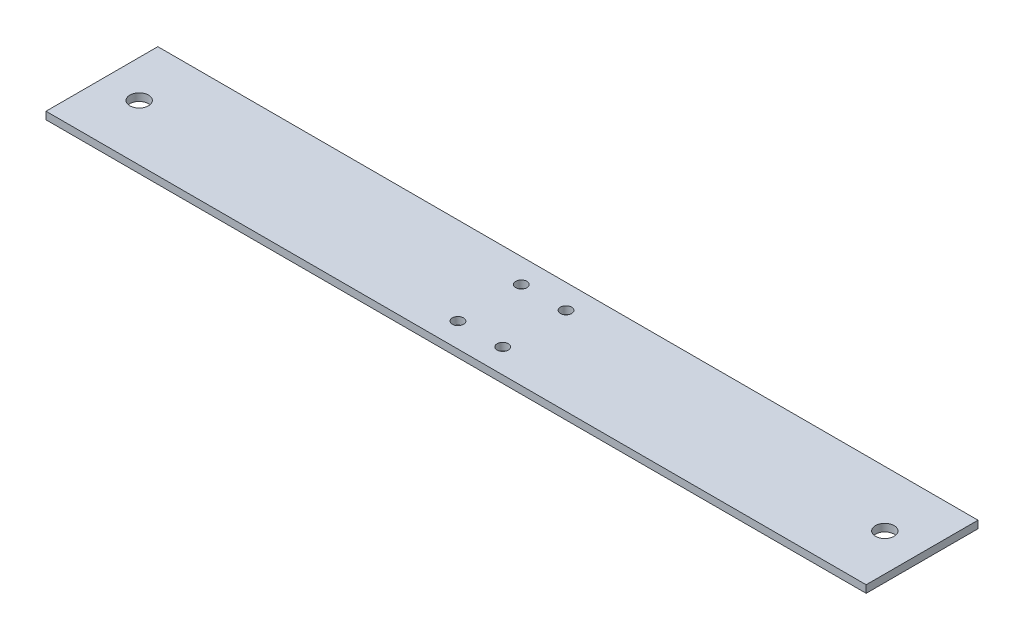
ISO-10303-21;
HEADER;
FILE_DESCRIPTION(('STEP AP214'),'2;1');
FILE_NAME('part.step','',(''),(''),'','','');
FILE_SCHEMA(('AUTOMOTIVE_DESIGN { 1 0 10303 214 1 1 1 1 }'));
ENDSEC;
DATA;
#1=APPLICATION_CONTEXT('core data for automotive mechanical design processes');
#2=APPLICATION_PROTOCOL_DEFINITION('international standard','automotive_design',2000,#1);
#3=PRODUCT_CONTEXT('',#1,'mechanical');
#4=PRODUCT('Part','Part','',(#3));
#5=PRODUCT_RELATED_PRODUCT_CATEGORY('part','',(#4));
#6=PRODUCT_DEFINITION_FORMATION('','',#4);
#7=PRODUCT_DEFINITION_CONTEXT('part definition',#1,'design');
#8=PRODUCT_DEFINITION('design','',#6,#7);
#9=PRODUCT_DEFINITION_SHAPE('','',#8);
#10=(LENGTH_UNIT() NAMED_UNIT(*) SI_UNIT(.MILLI.,.METRE.));
#11=(NAMED_UNIT(*) PLANE_ANGLE_UNIT() SI_UNIT($,.RADIAN.));
#12=(NAMED_UNIT(*) SI_UNIT($,.STERADIAN.) SOLID_ANGLE_UNIT());
#13=UNCERTAINTY_MEASURE_WITH_UNIT(LENGTH_MEASURE(1.E-05),#10,'distance_accuracy_value','');
#14=(GEOMETRIC_REPRESENTATION_CONTEXT(3) GLOBAL_UNCERTAINTY_ASSIGNED_CONTEXT((#13)) GLOBAL_UNIT_ASSIGNED_CONTEXT((#10,
#11,#12)) REPRESENTATION_CONTEXT('',''));
#15=CARTESIAN_POINT('',(0.,0.,0.));
#16=DIRECTION('',(0.,0.,1.));
#17=DIRECTION('',(1.,0.,0.));
#18=AXIS2_PLACEMENT_3D('',#15,#16,#17);
#19=CARTESIAN_POINT('',(110.,2.,-15.));
#20=DIRECTION('',(0.,1.,0.));
#21=DIRECTION('',(0.,0.,1.));
#22=AXIS2_PLACEMENT_3D('',#19,#20,#21);
#23=PLANE('',#22);
#24=CARTESIAN_POINT('',(-100.,2.,0.));
#25=DIRECTION('',(0.,1.,0.));
#26=DIRECTION('',(0.,0.,1.));
#27=AXIS2_PLACEMENT_3D('',#24,#25,#26);
#28=CIRCLE('',#27,2.50000000000001);
#29=CARTESIAN_POINT('',(-100.,2.,2.50000000000001));
#30=VERTEX_POINT('',#29);
#31=EDGE_CURVE('E133',#30,#30,#28,.T.);
#32=ORIENTED_EDGE('',*,*,#31,.F.);
#33=EDGE_LOOP('',(#32));
#34=FACE_BOUND('',#33,.T.);
#35=CARTESIAN_POINT('',(100.,2.,0.));
#36=DIRECTION('',(0.,1.,0.));
#37=DIRECTION('',(0.,0.,1.));
#38=AXIS2_PLACEMENT_3D('',#35,#36,#37);
#39=CIRCLE('',#38,2.50000000000001);
#40=CARTESIAN_POINT('',(100.,2.,2.50000000000001));
#41=VERTEX_POINT('',#40);
#42=EDGE_CURVE('E147',#41,#41,#39,.T.);
#43=ORIENTED_EDGE('',*,*,#42,.F.);
#44=EDGE_LOOP('',(#43));
#45=FACE_BOUND('',#44,.T.);
#46=CARTESIAN_POINT('',(-6.,2.,8.5));
#47=DIRECTION('',(0.,1.,0.));
#48=DIRECTION('',(0.,0.,1.));
#49=AXIS2_PLACEMENT_3D('',#46,#47,#48);
#50=CIRCLE('',#49,1.5);
#51=CARTESIAN_POINT('',(-6.,2.,10.));
#52=VERTEX_POINT('',#51);
#53=EDGE_CURVE('E126',#52,#52,#50,.F.);
#54=ORIENTED_EDGE('',*,*,#53,.T.);
#55=EDGE_LOOP('',(#54));
#56=FACE_BOUND('',#55,.T.);
#57=CARTESIAN_POINT('',(6.,2.,8.5));
#58=DIRECTION('',(0.,1.,0.));
#59=DIRECTION('',(0.,0.,1.));
#60=AXIS2_PLACEMENT_3D('',#57,#58,#59);
#61=CIRCLE('',#60,1.5);
#62=CARTESIAN_POINT('',(6.,2.,10.));
#63=VERTEX_POINT('',#62);
#64=EDGE_CURVE('E122',#63,#63,#61,.F.);
#65=ORIENTED_EDGE('',*,*,#64,.T.);
#66=EDGE_LOOP('',(#65));
#67=FACE_BOUND('',#66,.T.);
#68=DIRECTION('',(0.,0.,-1.));
#69=VECTOR('',#68,1.);
#70=CARTESIAN_POINT('',(110.,2.,15.));
#71=LINE('',#70,#69);
#72=CARTESIAN_POINT('',(110.,2.,15.));
#73=VERTEX_POINT('',#72);
#74=CARTESIAN_POINT('',(110.,2.,-15.));
#75=VERTEX_POINT('',#74);
#76=EDGE_CURVE('E103',#73,#75,#71,.T.);
#77=ORIENTED_EDGE('',*,*,#76,.T.);
#78=DIRECTION('',(-1.,0.,0.));
#79=VECTOR('',#78,1.);
#80=CARTESIAN_POINT('',(-110.,2.,-15.));
#81=LINE('',#80,#79);
#82=CARTESIAN_POINT('',(-110.,2.,-15.));
#83=VERTEX_POINT('',#82);
#84=EDGE_CURVE('E73',#75,#83,#81,.T.);
#85=ORIENTED_EDGE('',*,*,#84,.T.);
#86=DIRECTION('',(0.,0.,1.));
#87=VECTOR('',#86,1.);
#88=CARTESIAN_POINT('',(-110.,2.,15.));
#89=LINE('',#88,#87);
#90=CARTESIAN_POINT('',(-110.,2.,15.));
#91=VERTEX_POINT('',#90);
#92=EDGE_CURVE('E112',#83,#91,#89,.T.);
#93=ORIENTED_EDGE('',*,*,#92,.T.);
#94=DIRECTION('',(1.,0.,0.));
#95=VECTOR('',#94,1.);
#96=CARTESIAN_POINT('',(-110.,2.,15.));
#97=LINE('',#96,#95);
#98=EDGE_CURVE('E97',#91,#73,#97,.T.);
#99=ORIENTED_EDGE('',*,*,#98,.T.);
#100=EDGE_LOOP('',(#77,#85,#93,#99));
#101=FACE_BOUND('',#100,.T.);
#102=CARTESIAN_POINT('',(-6.,2.,-8.5));
#103=DIRECTION('',(0.,1.,0.));
#104=DIRECTION('',(0.,0.,1.));
#105=AXIS2_PLACEMENT_3D('',#102,#103,#104);
#106=CIRCLE('',#105,1.5);
#107=CARTESIAN_POINT('',(-6.,2.,-7.));
#108=VERTEX_POINT('',#107);
#109=EDGE_CURVE('E128',#108,#108,#106,.F.);
#110=ORIENTED_EDGE('',*,*,#109,.T.);
#111=EDGE_LOOP('',(#110));
#112=FACE_BOUND('',#111,.T.);
#113=CARTESIAN_POINT('',(6.,2.,-8.5));
#114=DIRECTION('',(0.,1.,0.));
#115=DIRECTION('',(0.,0.,1.));
#116=AXIS2_PLACEMENT_3D('',#113,#114,#115);
#117=CIRCLE('',#116,1.5);
#118=CARTESIAN_POINT('',(6.,2.,-7.));
#119=VERTEX_POINT('',#118);
#120=EDGE_CURVE('E42',#119,#119,#117,.F.);
#121=ORIENTED_EDGE('',*,*,#120,.T.);
#122=EDGE_LOOP('',(#121));
#123=FACE_BOUND('',#122,.T.);
#124=ADVANCED_FACE('F38',(#34,#45,#56,#67,#101,#112,#123),#23,.T.);
#125=CARTESIAN_POINT('',(-110.,2.,-15.));
#126=DIRECTION('',(0.,0.,1.));
#127=DIRECTION('',(1.,0.,0.));
#128=AXIS2_PLACEMENT_3D('',#125,#126,#127);
#129=PLANE('',#128);
#130=DIRECTION('',(-1.,0.,0.));
#131=VECTOR('',#130,1.);
#132=CARTESIAN_POINT('',(-110.,0.,-15.));
#133=LINE('',#132,#131);
#134=CARTESIAN_POINT('',(110.,0.,-15.));
#135=VERTEX_POINT('',#134);
#136=CARTESIAN_POINT('',(-110.,0.,-15.));
#137=VERTEX_POINT('',#136);
#138=EDGE_CURVE('E57',#135,#137,#133,.T.);
#139=ORIENTED_EDGE('',*,*,#138,.T.);
#140=DIRECTION('',(0.,-1.,0.));
#141=VECTOR('',#140,1.);
#142=CARTESIAN_POINT('',(-110.,2.,-15.));
#143=LINE('',#142,#141);
#144=EDGE_CURVE('E94',#83,#137,#143,.T.);
#145=ORIENTED_EDGE('',*,*,#144,.F.);
#146=ORIENTED_EDGE('',*,*,#84,.F.);
#147=DIRECTION('',(0.,-1.,0.));
#148=VECTOR('',#147,1.);
#149=CARTESIAN_POINT('',(110.,2.,-15.));
#150=LINE('',#149,#148);
#151=EDGE_CURVE('E125',#75,#135,#150,.T.);
#152=ORIENTED_EDGE('',*,*,#151,.T.);
#153=EDGE_LOOP('',(#139,#145,#146,#152));
#154=FACE_BOUND('',#153,.T.);
#155=ADVANCED_FACE('F152',(#154),#129,.F.);
#156=CARTESIAN_POINT('',(-110.,2.,15.));
#157=DIRECTION('',(1.,0.,0.));
#158=DIRECTION('',(0.,0.,-1.));
#159=AXIS2_PLACEMENT_3D('',#156,#157,#158);
#160=PLANE('',#159);
#161=DIRECTION('',(0.,0.,1.));
#162=VECTOR('',#161,1.);
#163=CARTESIAN_POINT('',(-110.,0.,15.));
#164=LINE('',#163,#162);
#165=CARTESIAN_POINT('',(-110.,0.,15.));
#166=VERTEX_POINT('',#165);
#167=EDGE_CURVE('E89',#137,#166,#164,.T.);
#168=ORIENTED_EDGE('',*,*,#167,.T.);
#169=DIRECTION('',(0.,-1.,0.));
#170=VECTOR('',#169,1.);
#171=CARTESIAN_POINT('',(-110.,2.,15.));
#172=LINE('',#171,#170);
#173=EDGE_CURVE('E92',#91,#166,#172,.T.);
#174=ORIENTED_EDGE('',*,*,#173,.F.);
#175=ORIENTED_EDGE('',*,*,#92,.F.);
#176=ORIENTED_EDGE('',*,*,#144,.T.);
#177=EDGE_LOOP('',(#168,#174,#175,#176));
#178=FACE_BOUND('',#177,.T.);
#179=ADVANCED_FACE('F90',(#178),#160,.F.);
#180=CARTESIAN_POINT('',(110.,2.,15.));
#181=DIRECTION('',(-1.,0.,0.));
#182=DIRECTION('',(0.,0.,1.));
#183=AXIS2_PLACEMENT_3D('',#180,#181,#182);
#184=PLANE('',#183);
#185=DIRECTION('',(0.,0.,-1.));
#186=VECTOR('',#185,1.);
#187=CARTESIAN_POINT('',(110.,0.,15.));
#188=LINE('',#187,#186);
#189=CARTESIAN_POINT('',(110.,0.,15.));
#190=VERTEX_POINT('',#189);
#191=EDGE_CURVE('E102',#190,#135,#188,.T.);
#192=ORIENTED_EDGE('',*,*,#191,.T.);
#193=ORIENTED_EDGE('',*,*,#151,.F.);
#194=ORIENTED_EDGE('',*,*,#76,.F.);
#195=DIRECTION('',(0.,-1.,0.));
#196=VECTOR('',#195,1.);
#197=CARTESIAN_POINT('',(110.,2.,15.));
#198=LINE('',#197,#196);
#199=EDGE_CURVE('E98',#73,#190,#198,.T.);
#200=ORIENTED_EDGE('',*,*,#199,.T.);
#201=EDGE_LOOP('',(#192,#193,#194,#200));
#202=FACE_BOUND('',#201,.T.);
#203=ADVANCED_FACE('F155',(#202),#184,.F.);
#204=CARTESIAN_POINT('',(0.,0.,0.));
#205=DIRECTION('',(0.,-1.,0.));
#206=DIRECTION('',(0.,0.,-1.));
#207=AXIS2_PLACEMENT_3D('',#204,#205,#206);
#208=PLANE('',#207);
#209=CARTESIAN_POINT('',(-100.,0.,0.));
#210=DIRECTION('',(0.,-1.,0.));
#211=DIRECTION('',(0.,0.,-1.));
#212=AXIS2_PLACEMENT_3D('',#209,#210,#211);
#213=CIRCLE('',#212,2.50000000000001);
#214=CARTESIAN_POINT('',(-100.,0.,-2.50000000000001));
#215=VERTEX_POINT('',#214);
#216=EDGE_CURVE('E137',#215,#215,#213,.F.);
#217=ORIENTED_EDGE('',*,*,#216,.T.);
#218=EDGE_LOOP('',(#217));
#219=FACE_BOUND('',#218,.T.);
#220=CARTESIAN_POINT('',(100.,0.,0.));
#221=DIRECTION('',(0.,-1.,0.));
#222=DIRECTION('',(0.,0.,-1.));
#223=AXIS2_PLACEMENT_3D('',#220,#221,#222);
#224=CIRCLE('',#223,2.50000000000001);
#225=CARTESIAN_POINT('',(100.,0.,-2.50000000000001));
#226=VERTEX_POINT('',#225);
#227=EDGE_CURVE('E142',#226,#226,#224,.F.);
#228=ORIENTED_EDGE('',*,*,#227,.T.);
#229=EDGE_LOOP('',(#228));
#230=FACE_BOUND('',#229,.T.);
#231=CARTESIAN_POINT('',(6.,0.,-8.5));
#232=DIRECTION('',(0.,-1.,0.));
#233=DIRECTION('',(0.,0.,-1.));
#234=AXIS2_PLACEMENT_3D('',#231,#232,#233);
#235=CIRCLE('',#234,1.5);
#236=CARTESIAN_POINT('',(6.,0.,-10.));
#237=VERTEX_POINT('',#236);
#238=EDGE_CURVE('E117',#237,#237,#235,.F.);
#239=ORIENTED_EDGE('',*,*,#238,.T.);
#240=EDGE_LOOP('',(#239));
#241=FACE_BOUND('',#240,.T.);
#242=CARTESIAN_POINT('',(-6.,0.,8.5));
#243=DIRECTION('',(0.,-1.,0.));
#244=DIRECTION('',(0.,0.,-1.));
#245=AXIS2_PLACEMENT_3D('',#242,#243,#244);
#246=CIRCLE('',#245,1.5);
#247=CARTESIAN_POINT('',(-6.,0.,7.));
#248=VERTEX_POINT('',#247);
#249=EDGE_CURVE('E48',#248,#248,#246,.F.);
#250=ORIENTED_EDGE('',*,*,#249,.T.);
#251=EDGE_LOOP('',(#250));
#252=FACE_BOUND('',#251,.T.);
#253=CARTESIAN_POINT('',(6.,0.,8.5));
#254=DIRECTION('',(0.,-1.,0.));
#255=DIRECTION('',(0.,0.,-1.));
#256=AXIS2_PLACEMENT_3D('',#253,#254,#255);
#257=CIRCLE('',#256,1.5);
#258=CARTESIAN_POINT('',(6.,0.,7.));
#259=VERTEX_POINT('',#258);
#260=EDGE_CURVE('E11',#259,#259,#257,.F.);
#261=ORIENTED_EDGE('',*,*,#260,.T.);
#262=EDGE_LOOP('',(#261));
#263=FACE_BOUND('',#262,.T.);
#264=CARTESIAN_POINT('',(-6.,0.,-8.5));
#265=DIRECTION('',(0.,-1.,0.));
#266=DIRECTION('',(0.,0.,-1.));
#267=AXIS2_PLACEMENT_3D('',#264,#265,#266);
#268=CIRCLE('',#267,1.5);
#269=CARTESIAN_POINT('',(-6.,0.,-10.));
#270=VERTEX_POINT('',#269);
#271=EDGE_CURVE('E110',#270,#270,#268,.F.);
#272=ORIENTED_EDGE('',*,*,#271,.T.);
#273=EDGE_LOOP('',(#272));
#274=FACE_BOUND('',#273,.T.);
#275=ORIENTED_EDGE('',*,*,#191,.F.);
#276=DIRECTION('',(1.,0.,0.));
#277=VECTOR('',#276,1.);
#278=CARTESIAN_POINT('',(-110.,0.,15.));
#279=LINE('',#278,#277);
#280=EDGE_CURVE('E83',#166,#190,#279,.T.);
#281=ORIENTED_EDGE('',*,*,#280,.F.);
#282=ORIENTED_EDGE('',*,*,#167,.F.);
#283=ORIENTED_EDGE('',*,*,#138,.F.);
#284=EDGE_LOOP('',(#275,#281,#282,#283));
#285=FACE_BOUND('',#284,.T.);
#286=ADVANCED_FACE('F100',(#219,#230,#241,#252,#263,#274,#285),#208,.T.);
#287=CARTESIAN_POINT('',(-100.,-0.00100000000000013,0.));
#288=DIRECTION('',(0.,1.,0.));
#289=DIRECTION('',(0.,0.,1.));
#290=AXIS2_PLACEMENT_3D('',#287,#288,#289);
#291=CYLINDRICAL_SURFACE('',#290,2.50000000000001);
#292=ORIENTED_EDGE('',*,*,#216,.F.);
#293=EDGE_LOOP('',(#292));
#294=FACE_BOUND('',#293,.T.);
#295=ORIENTED_EDGE('',*,*,#31,.T.);
#296=EDGE_LOOP('',(#295));
#297=FACE_BOUND('',#296,.T.);
#298=ADVANCED_FACE('F194',(#294,#297),#291,.F.);
#299=CARTESIAN_POINT('',(100.,-0.00100000000000013,0.));
#300=DIRECTION('',(0.,1.,0.));
#301=DIRECTION('',(0.,0.,1.));
#302=AXIS2_PLACEMENT_3D('',#299,#300,#301);
#303=CYLINDRICAL_SURFACE('',#302,2.50000000000001);
#304=ORIENTED_EDGE('',*,*,#227,.F.);
#305=EDGE_LOOP('',(#304));
#306=FACE_BOUND('',#305,.T.);
#307=ORIENTED_EDGE('',*,*,#42,.T.);
#308=EDGE_LOOP('',(#307));
#309=FACE_BOUND('',#308,.T.);
#310=ADVANCED_FACE('F204',(#306,#309),#303,.F.);
#311=CARTESIAN_POINT('',(-110.,2.,15.));
#312=DIRECTION('',(0.,0.,-1.));
#313=DIRECTION('',(-1.,0.,0.));
#314=AXIS2_PLACEMENT_3D('',#311,#312,#313);
#315=PLANE('',#314);
#316=ORIENTED_EDGE('',*,*,#280,.T.);
#317=ORIENTED_EDGE('',*,*,#199,.F.);
#318=ORIENTED_EDGE('',*,*,#98,.F.);
#319=ORIENTED_EDGE('',*,*,#173,.T.);
#320=EDGE_LOOP('',(#316,#317,#318,#319));
#321=FACE_BOUND('',#320,.T.);
#322=ADVANCED_FACE('F96',(#321),#315,.F.);
#323=CARTESIAN_POINT('',(6.,-4.24264068711929,8.5));
#324=DIRECTION('',(0.,1.,0.));
#325=DIRECTION('',(0.,0.,1.));
#326=AXIS2_PLACEMENT_3D('',#323,#324,#325);
#327=CYLINDRICAL_SURFACE('',#326,1.5);
#328=ORIENTED_EDGE('',*,*,#260,.F.);
#329=EDGE_LOOP('',(#328));
#330=FACE_BOUND('',#329,.T.);
#331=ORIENTED_EDGE('',*,*,#64,.F.);
#332=EDGE_LOOP('',(#331));
#333=FACE_BOUND('',#332,.T.);
#334=ADVANCED_FACE('F40',(#330,#333),#327,.F.);
#335=CARTESIAN_POINT('',(-6.,-4.24264068711929,8.5));
#336=DIRECTION('',(0.,1.,0.));
#337=DIRECTION('',(0.,0.,1.));
#338=AXIS2_PLACEMENT_3D('',#335,#336,#337);
#339=CYLINDRICAL_SURFACE('',#338,1.5);
#340=ORIENTED_EDGE('',*,*,#249,.F.);
#341=EDGE_LOOP('',(#340));
#342=FACE_BOUND('',#341,.T.);
#343=ORIENTED_EDGE('',*,*,#53,.F.);
#344=EDGE_LOOP('',(#343));
#345=FACE_BOUND('',#344,.T.);
#346=ADVANCED_FACE('F173',(#342,#345),#339,.F.);
#347=CARTESIAN_POINT('',(-6.,-4.24264068711929,-8.5));
#348=DIRECTION('',(0.,1.,0.));
#349=DIRECTION('',(0.,0.,1.));
#350=AXIS2_PLACEMENT_3D('',#347,#348,#349);
#351=CYLINDRICAL_SURFACE('',#350,1.5);
#352=ORIENTED_EDGE('',*,*,#271,.F.);
#353=EDGE_LOOP('',(#352));
#354=FACE_BOUND('',#353,.T.);
#355=ORIENTED_EDGE('',*,*,#109,.F.);
#356=EDGE_LOOP('',(#355));
#357=FACE_BOUND('',#356,.T.);
#358=ADVANCED_FACE('F168',(#354,#357),#351,.F.);
#359=CARTESIAN_POINT('',(6.,-4.24264068711929,-8.5));
#360=DIRECTION('',(0.,1.,0.));
#361=DIRECTION('',(0.,0.,1.));
#362=AXIS2_PLACEMENT_3D('',#359,#360,#361);
#363=CYLINDRICAL_SURFACE('',#362,1.5);
#364=ORIENTED_EDGE('',*,*,#238,.F.);
#365=EDGE_LOOP('',(#364));
#366=FACE_BOUND('',#365,.T.);
#367=ORIENTED_EDGE('',*,*,#120,.F.);
#368=EDGE_LOOP('',(#367));
#369=FACE_BOUND('',#368,.T.);
#370=ADVANCED_FACE('F159',(#366,#369),#363,.F.);
#371=CLOSED_SHELL('',(#124,#155,#179,#203,#286,#298,#310,#322,#334,#346,#358,#370));
#372=MANIFOLD_SOLID_BREP('B2',#371);
#373=ADVANCED_BREP_SHAPE_REPRESENTATION('',(#18,#372),#14);
#374=SHAPE_DEFINITION_REPRESENTATION(#9,#373);
ENDSEC;
END-ISO-10303-21;
